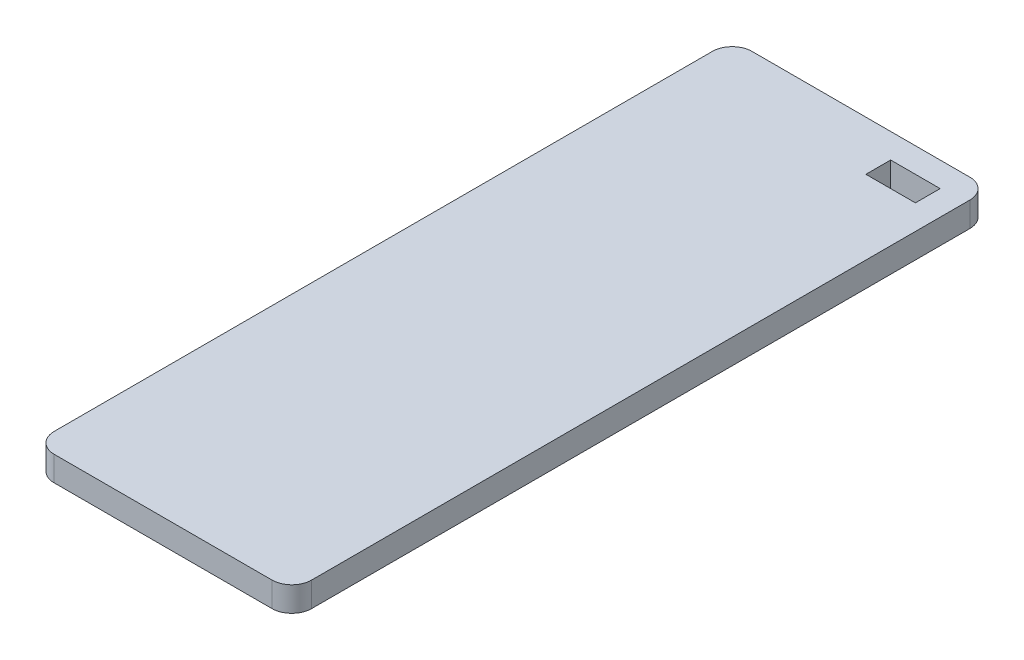
ISO-10303-21;
HEADER;
FILE_DESCRIPTION(('STEP AP214'),'2;1');
FILE_NAME('part.step','',(''),(''),'','','');
FILE_SCHEMA(('AUTOMOTIVE_DESIGN { 1 0 10303 214 1 1 1 1 }'));
ENDSEC;
DATA;
#1=APPLICATION_CONTEXT('core data for automotive mechanical design processes');
#2=APPLICATION_PROTOCOL_DEFINITION('international standard','automotive_design',2000,#1);
#3=PRODUCT_CONTEXT('',#1,'mechanical');
#4=PRODUCT('Part','Part','',(#3));
#5=PRODUCT_RELATED_PRODUCT_CATEGORY('part','',(#4));
#6=PRODUCT_DEFINITION_FORMATION('','',#4);
#7=PRODUCT_DEFINITION_CONTEXT('part definition',#1,'design');
#8=PRODUCT_DEFINITION('design','',#6,#7);
#9=PRODUCT_DEFINITION_SHAPE('','',#8);
#10=(LENGTH_UNIT() NAMED_UNIT(*) SI_UNIT(.MILLI.,.METRE.));
#11=(NAMED_UNIT(*) PLANE_ANGLE_UNIT() SI_UNIT($,.RADIAN.));
#12=(NAMED_UNIT(*) SI_UNIT($,.STERADIAN.) SOLID_ANGLE_UNIT());
#13=UNCERTAINTY_MEASURE_WITH_UNIT(LENGTH_MEASURE(1.E-05),#10,'distance_accuracy_value','');
#14=(GEOMETRIC_REPRESENTATION_CONTEXT(3) GLOBAL_UNCERTAINTY_ASSIGNED_CONTEXT((#13)) GLOBAL_UNIT_ASSIGNED_CONTEXT((#10,
#11,#12)) REPRESENTATION_CONTEXT('',''));
#15=CARTESIAN_POINT('',(0.,0.,0.));
#16=DIRECTION('',(0.,0.,1.));
#17=DIRECTION('',(1.,0.,0.));
#18=AXIS2_PLACEMENT_3D('',#15,#16,#17);
#19=CARTESIAN_POINT('',(-26.2810810810811,3.175,33.3087837837838));
#20=DIRECTION('',(1.,0.,0.));
#21=DIRECTION('',(0.,0.,-1.));
#22=AXIS2_PLACEMENT_3D('',#19,#20,#21);
#23=PLANE('',#22);
#24=DIRECTION('',(0.,0.,1.));
#25=VECTOR('',#24,1.);
#26=CARTESIAN_POINT('',(-26.2810810810811,3.175,33.3087837837838));
#27=LINE('',#26,#25);
#28=CARTESIAN_POINT('',(-26.2810810810811,3.175,-53.6762162162162));
#29=VERTEX_POINT('',#28);
#30=CARTESIAN_POINT('',(-26.2810810810811,3.175,30.7687837837838));
#31=VERTEX_POINT('',#30);
#32=EDGE_CURVE('E174',#29,#31,#27,.T.);
#33=ORIENTED_EDGE('',*,*,#32,.F.);
#34=DIRECTION('',(0.,-1.,0.));
#35=VECTOR('',#34,1.);
#36=CARTESIAN_POINT('',(-26.2810810810811,3.175,-53.6762162162162));
#37=LINE('',#36,#35);
#38=CARTESIAN_POINT('',(-26.2810810810811,0.,-53.6762162162162));
#39=VERTEX_POINT('',#38);
#40=EDGE_CURVE('E196',#29,#39,#37,.T.);
#41=ORIENTED_EDGE('',*,*,#40,.T.);
#42=DIRECTION('',(0.,0.,1.));
#43=VECTOR('',#42,1.);
#44=CARTESIAN_POINT('',(-26.2810810810811,0.,33.3087837837838));
#45=LINE('',#44,#43);
#46=CARTESIAN_POINT('',(-26.2810810810811,0.,30.7687837837838));
#47=VERTEX_POINT('',#46);
#48=EDGE_CURVE('E170',#39,#47,#45,.T.);
#49=ORIENTED_EDGE('',*,*,#48,.T.);
#50=DIRECTION('',(0.,-1.,0.));
#51=VECTOR('',#50,1.);
#52=CARTESIAN_POINT('',(-26.2810810810811,3.175,30.7687837837838));
#53=LINE('',#52,#51);
#54=EDGE_CURVE('E185',#47,#31,#53,.F.);
#55=ORIENTED_EDGE('',*,*,#54,.T.);
#56=EDGE_LOOP('',(#33,#41,#49,#55));
#57=FACE_BOUND('',#56,.T.);
#58=ADVANCED_FACE('F40',(#57),#23,.F.);
#59=CARTESIAN_POINT('',(-26.2810810810811,3.175,33.3087837837838));
#60=DIRECTION('',(0.,0.,-1.));
#61=DIRECTION('',(-1.,0.,0.));
#62=AXIS2_PLACEMENT_3D('',#59,#60,#61);
#63=PLANE('',#62);
#64=DIRECTION('',(1.,0.,0.));
#65=VECTOR('',#64,1.);
#66=CARTESIAN_POINT('',(-26.2810810810811,0.,33.3087837837838));
#67=LINE('',#66,#65);
#68=CARTESIAN_POINT('',(-23.7410810810811,0.,33.3087837837838));
#69=VERTEX_POINT('',#68);
#70=CARTESIAN_POINT('',(4.20891891891893,0.,33.3087837837838));
#71=VERTEX_POINT('',#70);
#72=EDGE_CURVE('E188',#69,#71,#67,.T.);
#73=ORIENTED_EDGE('',*,*,#72,.T.);
#74=DIRECTION('',(0.,-1.,0.));
#75=VECTOR('',#74,1.);
#76=CARTESIAN_POINT('',(4.20891891891893,3.175,33.3087837837838));
#77=LINE('',#76,#75);
#78=CARTESIAN_POINT('',(4.20891891891893,3.175,33.3087837837838));
#79=VERTEX_POINT('',#78);
#80=EDGE_CURVE('E11',#71,#79,#77,.F.);
#81=ORIENTED_EDGE('',*,*,#80,.T.);
#82=DIRECTION('',(1.,0.,0.));
#83=VECTOR('',#82,1.);
#84=CARTESIAN_POINT('',(-26.2810810810811,3.175,33.3087837837838));
#85=LINE('',#84,#83);
#86=CARTESIAN_POINT('',(-23.7410810810811,3.175,33.3087837837838));
#87=VERTEX_POINT('',#86);
#88=EDGE_CURVE('E177',#87,#79,#85,.T.);
#89=ORIENTED_EDGE('',*,*,#88,.F.);
#90=DIRECTION('',(0.,-1.,0.));
#91=VECTOR('',#90,1.);
#92=CARTESIAN_POINT('',(-23.7410810810811,3.175,33.3087837837838));
#93=LINE('',#92,#91);
#94=EDGE_CURVE('E48',#87,#69,#93,.T.);
#95=ORIENTED_EDGE('',*,*,#94,.T.);
#96=EDGE_LOOP('',(#73,#81,#89,#95));
#97=FACE_BOUND('',#96,.T.);
#98=ADVANCED_FACE('F227',(#97),#63,.F.);
#99=CARTESIAN_POINT('',(6.74891891891893,3.175,33.3087837837838));
#100=DIRECTION('',(-1.,0.,0.));
#101=DIRECTION('',(0.,0.,1.));
#102=AXIS2_PLACEMENT_3D('',#99,#100,#101);
#103=PLANE('',#102);
#104=DIRECTION('',(0.,0.,-1.));
#105=VECTOR('',#104,1.);
#106=CARTESIAN_POINT('',(6.74891891891893,0.,33.3087837837838));
#107=LINE('',#106,#105);
#108=CARTESIAN_POINT('',(6.74891891891893,0.,30.7687837837838));
#109=VERTEX_POINT('',#108);
#110=CARTESIAN_POINT('',(6.74891891891893,0.,-53.6762162162162));
#111=VERTEX_POINT('',#110);
#112=EDGE_CURVE('E191',#109,#111,#107,.T.);
#113=ORIENTED_EDGE('',*,*,#112,.T.);
#114=DIRECTION('',(0.,-1.,0.));
#115=VECTOR('',#114,1.);
#116=CARTESIAN_POINT('',(6.74891891891893,3.175,-53.6762162162162));
#117=LINE('',#116,#115);
#118=CARTESIAN_POINT('',(6.74891891891893,3.175,-53.6762162162162));
#119=VERTEX_POINT('',#118);
#120=EDGE_CURVE('E55',#111,#119,#117,.F.);
#121=ORIENTED_EDGE('',*,*,#120,.T.);
#122=DIRECTION('',(0.,0.,-1.));
#123=VECTOR('',#122,1.);
#124=CARTESIAN_POINT('',(6.74891891891893,3.175,33.3087837837838));
#125=LINE('',#124,#123);
#126=CARTESIAN_POINT('',(6.74891891891893,3.175,30.7687837837838));
#127=VERTEX_POINT('',#126);
#128=EDGE_CURVE('E180',#127,#119,#125,.T.);
#129=ORIENTED_EDGE('',*,*,#128,.F.);
#130=DIRECTION('',(0.,-1.,0.));
#131=VECTOR('',#130,1.);
#132=CARTESIAN_POINT('',(6.74891891891893,3.175,30.7687837837838));
#133=LINE('',#132,#131);
#134=EDGE_CURVE('E219',#127,#109,#133,.T.);
#135=ORIENTED_EDGE('',*,*,#134,.T.);
#136=EDGE_LOOP('',(#113,#121,#129,#135));
#137=FACE_BOUND('',#136,.T.);
#138=ADVANCED_FACE('F236',(#137),#103,.F.);
#139=CARTESIAN_POINT('',(-26.2810810810811,3.175,-56.2162162162162));
#140=DIRECTION('',(0.,0.,1.));
#141=DIRECTION('',(1.,0.,0.));
#142=AXIS2_PLACEMENT_3D('',#139,#140,#141);
#143=PLANE('',#142);
#144=DIRECTION('',(-1.,0.,0.));
#145=VECTOR('',#144,1.);
#146=CARTESIAN_POINT('',(-26.2810810810811,0.,-56.2162162162162));
#147=LINE('',#146,#145);
#148=CARTESIAN_POINT('',(4.20891891891893,0.,-56.2162162162162));
#149=VERTEX_POINT('',#148);
#150=CARTESIAN_POINT('',(-23.7410810810811,0.,-56.2162162162162));
#151=VERTEX_POINT('',#150);
#152=EDGE_CURVE('E178',#149,#151,#147,.T.);
#153=ORIENTED_EDGE('',*,*,#152,.T.);
#154=DIRECTION('',(0.,-1.,0.));
#155=VECTOR('',#154,1.);
#156=CARTESIAN_POINT('',(-23.7410810810811,3.175,-56.2162162162162));
#157=LINE('',#156,#155);
#158=CARTESIAN_POINT('',(-23.7410810810811,3.175,-56.2162162162162));
#159=VERTEX_POINT('',#158);
#160=EDGE_CURVE('E210',#151,#159,#157,.F.);
#161=ORIENTED_EDGE('',*,*,#160,.T.);
#162=DIRECTION('',(-1.,0.,0.));
#163=VECTOR('',#162,1.);
#164=CARTESIAN_POINT('',(-26.2810810810811,3.175,-56.2162162162162));
#165=LINE('',#164,#163);
#166=CARTESIAN_POINT('',(4.20891891891893,3.175,-56.2162162162162));
#167=VERTEX_POINT('',#166);
#168=EDGE_CURVE('E182',#167,#159,#165,.T.);
#169=ORIENTED_EDGE('',*,*,#168,.F.);
#170=DIRECTION('',(0.,-1.,0.));
#171=VECTOR('',#170,1.);
#172=CARTESIAN_POINT('',(4.20891891891893,3.175,-56.2162162162162));
#173=LINE('',#172,#171);
#174=EDGE_CURVE('E207',#167,#149,#173,.T.);
#175=ORIENTED_EDGE('',*,*,#174,.T.);
#176=EDGE_LOOP('',(#153,#161,#169,#175));
#177=FACE_BOUND('',#176,.T.);
#178=ADVANCED_FACE('F245',(#177),#143,.F.);
#179=CARTESIAN_POINT('',(0.,3.175,0.));
#180=DIRECTION('',(0.,-1.,0.));
#181=DIRECTION('',(0.,0.,-1.));
#182=AXIS2_PLACEMENT_3D('',#179,#180,#181);
#183=PLANE('',#182);
#184=DIRECTION('',(1.,0.,0.));
#185=VECTOR('',#184,1.);
#186=CARTESIAN_POINT('',(-2.77608108108107,3.175,-49.8662162162162));
#187=LINE('',#186,#185);
#188=CARTESIAN_POINT('',(-2.77608108108107,3.175,-49.8662162162162));
#189=VERTEX_POINT('',#188);
#190=CARTESIAN_POINT('',(3.57391891891893,3.175,-49.8662162162162));
#191=VERTEX_POINT('',#190);
#192=EDGE_CURVE('E164',#189,#191,#187,.T.);
#193=ORIENTED_EDGE('',*,*,#192,.F.);
#194=DIRECTION('',(0.,0.,1.));
#195=VECTOR('',#194,1.);
#196=CARTESIAN_POINT('',(-2.77608108108107,3.175,-49.8662162162162));
#197=LINE('',#196,#195);
#198=CARTESIAN_POINT('',(-2.77608108108107,3.175,-53.0412162162162));
#199=VERTEX_POINT('',#198);
#200=EDGE_CURVE('E137',#199,#189,#197,.T.);
#201=ORIENTED_EDGE('',*,*,#200,.F.);
#202=DIRECTION('',(-1.,0.,0.));
#203=VECTOR('',#202,1.);
#204=CARTESIAN_POINT('',(-2.77608108108107,3.175,-53.0412162162162));
#205=LINE('',#204,#203);
#206=CARTESIAN_POINT('',(3.57391891891893,3.175,-53.0412162162162));
#207=VERTEX_POINT('',#206);
#208=EDGE_CURVE('E155',#207,#199,#205,.T.);
#209=ORIENTED_EDGE('',*,*,#208,.F.);
#210=DIRECTION('',(0.,0.,-1.));
#211=VECTOR('',#210,1.);
#212=CARTESIAN_POINT('',(3.57391891891893,3.175,-49.8662162162162));
#213=LINE('',#212,#211);
#214=EDGE_CURVE('E158',#191,#207,#213,.T.);
#215=ORIENTED_EDGE('',*,*,#214,.F.);
#216=EDGE_LOOP('',(#193,#201,#209,#215));
#217=FACE_BOUND('',#216,.T.);
#218=ORIENTED_EDGE('',*,*,#168,.T.);
#219=CARTESIAN_POINT('',(-23.7410810810811,3.175,-53.6762162162162));
#220=DIRECTION('',(0.,-1.,0.));
#221=DIRECTION('',(0.,0.,-1.));
#222=AXIS2_PLACEMENT_3D('',#219,#220,#221);
#223=CIRCLE('',#222,2.54);
#224=EDGE_CURVE('E217',#159,#29,#223,.F.);
#225=ORIENTED_EDGE('',*,*,#224,.T.);
#226=ORIENTED_EDGE('',*,*,#32,.T.);
#227=CARTESIAN_POINT('',(-23.7410810810811,3.175,30.7687837837838));
#228=DIRECTION('',(0.,-1.,0.));
#229=DIRECTION('',(0.,0.,-1.));
#230=AXIS2_PLACEMENT_3D('',#227,#228,#229);
#231=CIRCLE('',#230,2.54);
#232=EDGE_CURVE('E212',#31,#87,#231,.F.);
#233=ORIENTED_EDGE('',*,*,#232,.T.);
#234=ORIENTED_EDGE('',*,*,#88,.T.);
#235=CARTESIAN_POINT('',(4.20891891891893,3.175,30.7687837837838));
#236=DIRECTION('',(0.,-1.,0.));
#237=DIRECTION('',(0.,0.,-1.));
#238=AXIS2_PLACEMENT_3D('',#235,#236,#237);
#239=CIRCLE('',#238,2.54);
#240=EDGE_CURVE('E62',#79,#127,#239,.F.);
#241=ORIENTED_EDGE('',*,*,#240,.T.);
#242=ORIENTED_EDGE('',*,*,#128,.T.);
#243=CARTESIAN_POINT('',(4.20891891891893,3.175,-53.6762162162162));
#244=DIRECTION('',(0.,-1.,0.));
#245=DIRECTION('',(0.,0.,-1.));
#246=AXIS2_PLACEMENT_3D('',#243,#244,#245);
#247=CIRCLE('',#246,2.54);
#248=EDGE_CURVE('E215',#119,#167,#247,.F.);
#249=ORIENTED_EDGE('',*,*,#248,.T.);
#250=EDGE_LOOP('',(#218,#225,#226,#233,#234,#241,#242,#249));
#251=FACE_BOUND('',#250,.T.);
#252=ADVANCED_FACE('F238',(#217,#251),#183,.F.);
#253=CARTESIAN_POINT('',(0.,0.,0.));
#254=DIRECTION('',(0.,-1.,0.));
#255=DIRECTION('',(0.,0.,-1.));
#256=AXIS2_PLACEMENT_3D('',#253,#254,#255);
#257=PLANE('',#256);
#258=DIRECTION('',(0.,0.,1.));
#259=VECTOR('',#258,1.);
#260=CARTESIAN_POINT('',(-2.77608108108107,0.,-49.8662162162162));
#261=LINE('',#260,#259);
#262=CARTESIAN_POINT('',(-2.77608108108107,0.,-53.0412162162162));
#263=VERTEX_POINT('',#262);
#264=CARTESIAN_POINT('',(-2.77608108108107,0.,-49.8662162162162));
#265=VERTEX_POINT('',#264);
#266=EDGE_CURVE('E134',#263,#265,#261,.T.);
#267=ORIENTED_EDGE('',*,*,#266,.T.);
#268=DIRECTION('',(1.,0.,0.));
#269=VECTOR('',#268,1.);
#270=CARTESIAN_POINT('',(-2.77608108108107,0.,-49.8662162162162));
#271=LINE('',#270,#269);
#272=CARTESIAN_POINT('',(3.57391891891893,0.,-49.8662162162162));
#273=VERTEX_POINT('',#272);
#274=EDGE_CURVE('E146',#265,#273,#271,.T.);
#275=ORIENTED_EDGE('',*,*,#274,.T.);
#276=DIRECTION('',(0.,0.,-1.));
#277=VECTOR('',#276,1.);
#278=CARTESIAN_POINT('',(3.57391891891893,0.,-49.8662162162162));
#279=LINE('',#278,#277);
#280=CARTESIAN_POINT('',(3.57391891891893,0.,-53.0412162162162));
#281=VERTEX_POINT('',#280);
#282=EDGE_CURVE('E150',#273,#281,#279,.T.);
#283=ORIENTED_EDGE('',*,*,#282,.T.);
#284=DIRECTION('',(-1.,0.,0.));
#285=VECTOR('',#284,1.);
#286=CARTESIAN_POINT('',(-2.77608108108107,0.,-53.0412162162162));
#287=LINE('',#286,#285);
#288=EDGE_CURVE('E142',#281,#263,#287,.T.);
#289=ORIENTED_EDGE('',*,*,#288,.T.);
#290=EDGE_LOOP('',(#267,#275,#283,#289));
#291=FACE_BOUND('',#290,.T.);
#292=ORIENTED_EDGE('',*,*,#48,.F.);
#293=CARTESIAN_POINT('',(-23.7410810810811,0.,-53.6762162162162));
#294=DIRECTION('',(0.,-1.,0.));
#295=DIRECTION('',(0.,0.,-1.));
#296=AXIS2_PLACEMENT_3D('',#293,#294,#295);
#297=CIRCLE('',#296,2.54);
#298=EDGE_CURVE('E205',#39,#151,#297,.T.);
#299=ORIENTED_EDGE('',*,*,#298,.T.);
#300=ORIENTED_EDGE('',*,*,#152,.F.);
#301=CARTESIAN_POINT('',(4.20891891891893,0.,-53.6762162162162));
#302=DIRECTION('',(0.,-1.,0.));
#303=DIRECTION('',(0.,0.,-1.));
#304=AXIS2_PLACEMENT_3D('',#301,#302,#303);
#305=CIRCLE('',#304,2.54);
#306=EDGE_CURVE('E203',#149,#111,#305,.T.);
#307=ORIENTED_EDGE('',*,*,#306,.T.);
#308=ORIENTED_EDGE('',*,*,#112,.F.);
#309=CARTESIAN_POINT('',(4.20891891891893,0.,30.7687837837838));
#310=DIRECTION('',(0.,-1.,0.));
#311=DIRECTION('',(0.,0.,-1.));
#312=AXIS2_PLACEMENT_3D('',#309,#310,#311);
#313=CIRCLE('',#312,2.54);
#314=EDGE_CURVE('E201',#109,#71,#313,.T.);
#315=ORIENTED_EDGE('',*,*,#314,.T.);
#316=ORIENTED_EDGE('',*,*,#72,.F.);
#317=CARTESIAN_POINT('',(-23.7410810810811,0.,30.7687837837838));
#318=DIRECTION('',(0.,-1.,0.));
#319=DIRECTION('',(0.,0.,-1.));
#320=AXIS2_PLACEMENT_3D('',#317,#318,#319);
#321=CIRCLE('',#320,2.54);
#322=EDGE_CURVE('E199',#69,#47,#321,.T.);
#323=ORIENTED_EDGE('',*,*,#322,.T.);
#324=EDGE_LOOP('',(#292,#299,#300,#307,#308,#315,#316,#323));
#325=FACE_BOUND('',#324,.T.);
#326=ADVANCED_FACE('F152',(#291,#325),#257,.T.);
#327=CARTESIAN_POINT('',(-2.77608108108107,0.,-49.8662162162162));
#328=DIRECTION('',(-1.,0.,0.));
#329=DIRECTION('',(0.,0.,1.));
#330=AXIS2_PLACEMENT_3D('',#327,#328,#329);
#331=PLANE('',#330);
#332=ORIENTED_EDGE('',*,*,#200,.T.);
#333=DIRECTION('',(0.,1.,0.));
#334=VECTOR('',#333,1.);
#335=CARTESIAN_POINT('',(-2.77608108108107,0.,-49.8662162162162));
#336=LINE('',#335,#334);
#337=EDGE_CURVE('E130',#265,#189,#336,.T.);
#338=ORIENTED_EDGE('',*,*,#337,.F.);
#339=ORIENTED_EDGE('',*,*,#266,.F.);
#340=DIRECTION('',(0.,1.,0.));
#341=VECTOR('',#340,1.);
#342=CARTESIAN_POINT('',(-2.77608108108107,0.,-53.0412162162162));
#343=LINE('',#342,#341);
#344=EDGE_CURVE('E168',#263,#199,#343,.T.);
#345=ORIENTED_EDGE('',*,*,#344,.T.);
#346=EDGE_LOOP('',(#332,#338,#339,#345));
#347=FACE_BOUND('',#346,.T.);
#348=ADVANCED_FACE('F132',(#347),#331,.F.);
#349=CARTESIAN_POINT('',(-2.77608108108107,0.,-53.0412162162162));
#350=DIRECTION('',(0.,0.,-1.));
#351=DIRECTION('',(-1.,0.,0.));
#352=AXIS2_PLACEMENT_3D('',#349,#350,#351);
#353=PLANE('',#352);
#354=ORIENTED_EDGE('',*,*,#208,.T.);
#355=ORIENTED_EDGE('',*,*,#344,.F.);
#356=ORIENTED_EDGE('',*,*,#288,.F.);
#357=DIRECTION('',(0.,1.,0.));
#358=VECTOR('',#357,1.);
#359=CARTESIAN_POINT('',(3.57391891891893,0.,-53.0412162162162));
#360=LINE('',#359,#358);
#361=EDGE_CURVE('E171',#281,#207,#360,.T.);
#362=ORIENTED_EDGE('',*,*,#361,.T.);
#363=EDGE_LOOP('',(#354,#355,#356,#362));
#364=FACE_BOUND('',#363,.T.);
#365=ADVANCED_FACE('F312',(#364),#353,.F.);
#366=CARTESIAN_POINT('',(3.57391891891893,0.,-49.8662162162162));
#367=DIRECTION('',(1.,0.,0.));
#368=DIRECTION('',(0.,0.,-1.));
#369=AXIS2_PLACEMENT_3D('',#366,#367,#368);
#370=PLANE('',#369);
#371=ORIENTED_EDGE('',*,*,#214,.T.);
#372=ORIENTED_EDGE('',*,*,#361,.F.);
#373=ORIENTED_EDGE('',*,*,#282,.F.);
#374=DIRECTION('',(0.,1.,0.));
#375=VECTOR('',#374,1.);
#376=CARTESIAN_POINT('',(3.57391891891893,0.,-49.8662162162162));
#377=LINE('',#376,#375);
#378=EDGE_CURVE('E141',#273,#191,#377,.T.);
#379=ORIENTED_EDGE('',*,*,#378,.T.);
#380=EDGE_LOOP('',(#371,#372,#373,#379));
#381=FACE_BOUND('',#380,.T.);
#382=ADVANCED_FACE('F303',(#381),#370,.F.);
#383=CARTESIAN_POINT('',(-2.77608108108107,0.,-49.8662162162162));
#384=DIRECTION('',(0.,0.,1.));
#385=DIRECTION('',(1.,0.,0.));
#386=AXIS2_PLACEMENT_3D('',#383,#384,#385);
#387=PLANE('',#386);
#388=ORIENTED_EDGE('',*,*,#192,.T.);
#389=ORIENTED_EDGE('',*,*,#378,.F.);
#390=ORIENTED_EDGE('',*,*,#274,.F.);
#391=ORIENTED_EDGE('',*,*,#337,.T.);
#392=EDGE_LOOP('',(#388,#389,#390,#391));
#393=FACE_BOUND('',#392,.T.);
#394=ADVANCED_FACE('F147',(#393),#387,.F.);
#395=CARTESIAN_POINT('',(-23.7410810810811,3.175,-53.6762162162162));
#396=DIRECTION('',(0.,-1.,0.));
#397=DIRECTION('',(0.,0.,-1.));
#398=AXIS2_PLACEMENT_3D('',#395,#396,#397);
#399=CYLINDRICAL_SURFACE('',#398,2.54);
#400=ORIENTED_EDGE('',*,*,#224,.F.);
#401=ORIENTED_EDGE('',*,*,#160,.F.);
#402=ORIENTED_EDGE('',*,*,#298,.F.);
#403=ORIENTED_EDGE('',*,*,#40,.F.);
#404=EDGE_LOOP('',(#400,#401,#402,#403));
#405=FACE_BOUND('',#404,.T.);
#406=ADVANCED_FACE('F250',(#405),#399,.T.);
#407=CARTESIAN_POINT('',(4.20891891891893,3.175,-53.6762162162162));
#408=DIRECTION('',(0.,-1.,0.));
#409=DIRECTION('',(0.,0.,-1.));
#410=AXIS2_PLACEMENT_3D('',#407,#408,#409);
#411=CYLINDRICAL_SURFACE('',#410,2.54);
#412=ORIENTED_EDGE('',*,*,#248,.F.);
#413=ORIENTED_EDGE('',*,*,#120,.F.);
#414=ORIENTED_EDGE('',*,*,#306,.F.);
#415=ORIENTED_EDGE('',*,*,#174,.F.);
#416=EDGE_LOOP('',(#412,#413,#414,#415));
#417=FACE_BOUND('',#416,.T.);
#418=ADVANCED_FACE('F242',(#417),#411,.T.);
#419=CARTESIAN_POINT('',(4.20891891891893,3.175,30.7687837837838));
#420=DIRECTION('',(0.,-1.,0.));
#421=DIRECTION('',(0.,0.,-1.));
#422=AXIS2_PLACEMENT_3D('',#419,#420,#421);
#423=CYLINDRICAL_SURFACE('',#422,2.54);
#424=ORIENTED_EDGE('',*,*,#240,.F.);
#425=ORIENTED_EDGE('',*,*,#80,.F.);
#426=ORIENTED_EDGE('',*,*,#314,.F.);
#427=ORIENTED_EDGE('',*,*,#134,.F.);
#428=EDGE_LOOP('',(#424,#425,#426,#427));
#429=FACE_BOUND('',#428,.T.);
#430=ADVANCED_FACE('F235',(#429),#423,.T.);
#431=CARTESIAN_POINT('',(-23.7410810810811,3.175,30.7687837837838));
#432=DIRECTION('',(0.,-1.,0.));
#433=DIRECTION('',(0.,0.,-1.));
#434=AXIS2_PLACEMENT_3D('',#431,#432,#433);
#435=CYLINDRICAL_SURFACE('',#434,2.54);
#436=ORIENTED_EDGE('',*,*,#232,.F.);
#437=ORIENTED_EDGE('',*,*,#54,.F.);
#438=ORIENTED_EDGE('',*,*,#322,.F.);
#439=ORIENTED_EDGE('',*,*,#94,.F.);
#440=EDGE_LOOP('',(#436,#437,#438,#439));
#441=FACE_BOUND('',#440,.T.);
#442=ADVANCED_FACE('F42',(#441),#435,.T.);
#443=CLOSED_SHELL('',(#58,#98,#138,#178,#252,#326,#348,#365,#382,#394,#406,#418,#430,#442));
#444=MANIFOLD_SOLID_BREP('B2',#443);
#445=ADVANCED_BREP_SHAPE_REPRESENTATION('',(#18,#444),#14);
#446=SHAPE_DEFINITION_REPRESENTATION(#9,#445);
ENDSEC;
END-ISO-10303-21;
